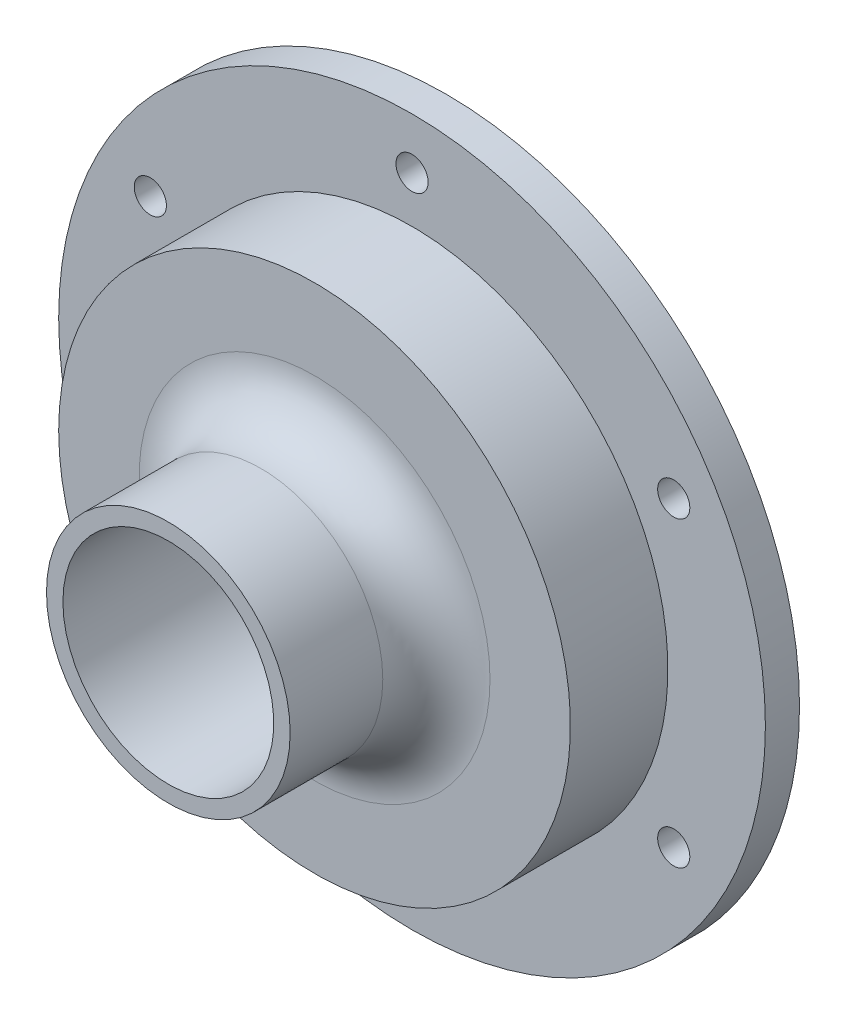
ISO-10303-21;
HEADER;
FILE_DESCRIPTION(('STEP AP214'),'2;1');
FILE_NAME('part.step','',(''),(''),'','','');
FILE_SCHEMA(('AUTOMOTIVE_DESIGN { 1 0 10303 214 1 1 1 1 }'));
ENDSEC;
DATA;
#1=APPLICATION_CONTEXT('core data for automotive mechanical design processes');
#2=APPLICATION_PROTOCOL_DEFINITION('international standard','automotive_design',2000,#1);
#3=PRODUCT_CONTEXT('',#1,'mechanical');
#4=PRODUCT('Part','Part','',(#3));
#5=PRODUCT_RELATED_PRODUCT_CATEGORY('part','',(#4));
#6=PRODUCT_DEFINITION_FORMATION('','',#4);
#7=PRODUCT_DEFINITION_CONTEXT('part definition',#1,'design');
#8=PRODUCT_DEFINITION('design','',#6,#7);
#9=PRODUCT_DEFINITION_SHAPE('','',#8);
#10=(LENGTH_UNIT() NAMED_UNIT(*) SI_UNIT(.MILLI.,.METRE.));
#11=(NAMED_UNIT(*) PLANE_ANGLE_UNIT() SI_UNIT($,.RADIAN.));
#12=(NAMED_UNIT(*) SI_UNIT($,.STERADIAN.) SOLID_ANGLE_UNIT());
#13=UNCERTAINTY_MEASURE_WITH_UNIT(LENGTH_MEASURE(1.E-05),#10,'distance_accuracy_value','');
#14=(GEOMETRIC_REPRESENTATION_CONTEXT(3) GLOBAL_UNCERTAINTY_ASSIGNED_CONTEXT((#13)) GLOBAL_UNIT_ASSIGNED_CONTEXT((#10,
#11,#12)) REPRESENTATION_CONTEXT('',''));
#15=CARTESIAN_POINT('',(0.,0.,0.));
#16=DIRECTION('',(0.,0.,1.));
#17=DIRECTION('',(1.,0.,0.));
#18=AXIS2_PLACEMENT_3D('',#15,#16,#17);
#19=CARTESIAN_POINT('',(0.,0.,0.));
#20=DIRECTION('',(0.,0.,-1.));
#21=DIRECTION('',(-1.,0.,0.));
#22=AXIS2_PLACEMENT_3D('',#19,#20,#21);
#23=CYLINDRICAL_SURFACE('',#22,72.5);
#24=CARTESIAN_POINT('',(0.,0.,7.));
#25=DIRECTION('',(0.,0.,-1.));
#26=DIRECTION('',(-1.,0.,0.));
#27=AXIS2_PLACEMENT_3D('',#24,#25,#26);
#28=CIRCLE('',#27,72.5);
#29=CARTESIAN_POINT('',(-72.5,0.,7.));
#30=VERTEX_POINT('',#29);
#31=EDGE_CURVE('E43',#30,#30,#28,.T.);
#32=ORIENTED_EDGE('',*,*,#31,.T.);
#33=EDGE_LOOP('',(#32));
#34=FACE_BOUND('',#33,.T.);
#35=CARTESIAN_POINT('',(0.,0.,0.));
#36=DIRECTION('',(0.,0.,-1.));
#37=DIRECTION('',(-1.,0.,0.));
#38=AXIS2_PLACEMENT_3D('',#35,#36,#37);
#39=CIRCLE('',#38,72.5);
#40=CARTESIAN_POINT('',(-72.5,0.,0.));
#41=VERTEX_POINT('',#40);
#42=EDGE_CURVE('E50',#41,#41,#39,.T.);
#43=ORIENTED_EDGE('',*,*,#42,.F.);
#44=EDGE_LOOP('',(#43));
#45=FACE_BOUND('',#44,.T.);
#46=ADVANCED_FACE('F30',(#34,#45),#23,.T.);
#47=CARTESIAN_POINT('',(-72.5,0.,7.));
#48=DIRECTION('',(0.,0.,1.));
#49=DIRECTION('',(1.,0.,0.));
#50=AXIS2_PLACEMENT_3D('',#47,#48,#49);
#51=PLANE('',#50);
#52=CARTESIAN_POINT('',(-53.6935750346348,31.0000000000006,7.));
#53=DIRECTION('',(0.,0.,1.));
#54=DIRECTION('',(1.,0.,0.));
#55=AXIS2_PLACEMENT_3D('',#52,#53,#54);
#56=CIRCLE('',#55,3.29999999999999);
#57=CARTESIAN_POINT('',(-50.3935750346348,31.0000000000006,7.));
#58=VERTEX_POINT('',#57);
#59=EDGE_CURVE('E34',#58,#58,#56,.T.);
#60=ORIENTED_EDGE('',*,*,#59,.F.);
#61=EDGE_LOOP('',(#60));
#62=FACE_BOUND('',#61,.T.);
#63=CARTESIAN_POINT('',(-53.6935750346355,-30.9999999999995,7.));
#64=DIRECTION('',(0.,0.,1.));
#65=DIRECTION('',(1.,0.,0.));
#66=AXIS2_PLACEMENT_3D('',#63,#64,#65);
#67=CIRCLE('',#66,3.29999999999999);
#68=CARTESIAN_POINT('',(-50.3935750346355,-30.9999999999995,7.));
#69=VERTEX_POINT('',#68);
#70=EDGE_CURVE('E66',#69,#69,#67,.T.);
#71=ORIENTED_EDGE('',*,*,#70,.F.);
#72=EDGE_LOOP('',(#71));
#73=FACE_BOUND('',#72,.T.);
#74=CARTESIAN_POINT('',(0.,-62.,7.));
#75=DIRECTION('',(0.,0.,1.));
#76=DIRECTION('',(1.,0.,0.));
#77=AXIS2_PLACEMENT_3D('',#74,#75,#76);
#78=CIRCLE('',#77,3.29999999999999);
#79=CARTESIAN_POINT('',(3.29999999999999,-62.,7.));
#80=VERTEX_POINT('',#79);
#81=EDGE_CURVE('E62',#80,#80,#78,.T.);
#82=ORIENTED_EDGE('',*,*,#81,.F.);
#83=EDGE_LOOP('',(#82));
#84=FACE_BOUND('',#83,.T.);
#85=CARTESIAN_POINT('',(53.6935750346351,-31.0000000000003,7.));
#86=DIRECTION('',(0.,0.,1.));
#87=DIRECTION('',(1.,0.,0.));
#88=AXIS2_PLACEMENT_3D('',#85,#86,#87);
#89=CIRCLE('',#88,3.29999999999999);
#90=CARTESIAN_POINT('',(56.9935750346351,-31.0000000000003,7.));
#91=VERTEX_POINT('',#90);
#92=EDGE_CURVE('E57',#91,#91,#89,.T.);
#93=ORIENTED_EDGE('',*,*,#92,.F.);
#94=EDGE_LOOP('',(#93));
#95=FACE_BOUND('',#94,.T.);
#96=CARTESIAN_POINT('',(53.6935750346353,30.9999999999999,7.));
#97=DIRECTION('',(0.,0.,1.));
#98=DIRECTION('',(1.,0.,0.));
#99=AXIS2_PLACEMENT_3D('',#96,#97,#98);
#100=CIRCLE('',#99,3.29999999999999);
#101=CARTESIAN_POINT('',(56.9935750346353,30.9999999999999,7.));
#102=VERTEX_POINT('',#101);
#103=EDGE_CURVE('E52',#102,#102,#100,.T.);
#104=ORIENTED_EDGE('',*,*,#103,.F.);
#105=EDGE_LOOP('',(#104));
#106=FACE_BOUND('',#105,.T.);
#107=CARTESIAN_POINT('',(0.,62.,7.));
#108=DIRECTION('',(0.,0.,1.));
#109=DIRECTION('',(1.,0.,0.));
#110=AXIS2_PLACEMENT_3D('',#107,#108,#109);
#111=CIRCLE('',#110,3.29999999999999);
#112=CARTESIAN_POINT('',(3.29999999999999,62.,7.));
#113=VERTEX_POINT('',#112);
#114=EDGE_CURVE('E47',#113,#113,#111,.T.);
#115=ORIENTED_EDGE('',*,*,#114,.F.);
#116=EDGE_LOOP('',(#115));
#117=FACE_BOUND('',#116,.T.);
#118=CARTESIAN_POINT('',(0.,0.,7.));
#119=DIRECTION('',(0.,0.,-1.));
#120=DIRECTION('',(-1.,0.,0.));
#121=AXIS2_PLACEMENT_3D('',#118,#119,#120);
#122=CIRCLE('',#121,52.5);
#123=CARTESIAN_POINT('',(-52.5,0.,7.));
#124=VERTEX_POINT('',#123);
#125=EDGE_CURVE('E124',#124,#124,#122,.T.);
#126=ORIENTED_EDGE('',*,*,#125,.T.);
#127=EDGE_LOOP('',(#126));
#128=FACE_BOUND('',#127,.T.);
#129=ORIENTED_EDGE('',*,*,#31,.F.);
#130=EDGE_LOOP('',(#129));
#131=FACE_BOUND('',#130,.T.);
#132=ADVANCED_FACE('F131',(#62,#73,#84,#95,#106,#117,#128,#131),#51,.T.);
#133=CARTESIAN_POINT('',(0.,0.,0.));
#134=DIRECTION('',(0.,0.,-1.));
#135=DIRECTION('',(-1.,0.,0.));
#136=AXIS2_PLACEMENT_3D('',#133,#134,#135);
#137=CYLINDRICAL_SURFACE('',#136,52.5);
#138=CARTESIAN_POINT('',(0.,0.,27.));
#139=DIRECTION('',(0.,0.,-1.));
#140=DIRECTION('',(-1.,0.,0.));
#141=AXIS2_PLACEMENT_3D('',#138,#139,#140);
#142=CIRCLE('',#141,52.5);
#143=CARTESIAN_POINT('',(-52.5,0.,27.));
#144=VERTEX_POINT('',#143);
#145=EDGE_CURVE('E121',#144,#144,#142,.T.);
#146=ORIENTED_EDGE('',*,*,#145,.T.);
#147=EDGE_LOOP('',(#146));
#148=FACE_BOUND('',#147,.T.);
#149=ORIENTED_EDGE('',*,*,#125,.F.);
#150=EDGE_LOOP('',(#149));
#151=FACE_BOUND('',#150,.T.);
#152=ADVANCED_FACE('F133',(#148,#151),#137,.T.);
#153=CARTESIAN_POINT('',(-52.5,0.,27.));
#154=DIRECTION('',(0.,0.,1.));
#155=DIRECTION('',(1.,0.,0.));
#156=AXIS2_PLACEMENT_3D('',#153,#154,#155);
#157=PLANE('',#156);
#158=CARTESIAN_POINT('',(0.,0.,27.));
#159=DIRECTION('',(0.,0.,1.));
#160=DIRECTION('',(1.,0.,0.));
#161=AXIS2_PLACEMENT_3D('',#158,#159,#160);
#162=CIRCLE('',#161,36.);
#163=CARTESIAN_POINT('',(36.,0.,27.));
#164=VERTEX_POINT('',#163);
#165=EDGE_CURVE('E38',#164,#164,#162,.F.);
#166=ORIENTED_EDGE('',*,*,#165,.T.);
#167=EDGE_LOOP('',(#166));
#168=FACE_BOUND('',#167,.T.);
#169=ORIENTED_EDGE('',*,*,#145,.F.);
#170=EDGE_LOOP('',(#169));
#171=FACE_BOUND('',#170,.T.);
#172=ADVANCED_FACE('F140',(#168,#171),#157,.T.);
#173=CARTESIAN_POINT('',(0.,0.,0.));
#174=DIRECTION('',(0.,0.,-1.));
#175=DIRECTION('',(-1.,0.,0.));
#176=AXIS2_PLACEMENT_3D('',#173,#174,#175);
#177=CYLINDRICAL_SURFACE('',#176,25.);
#178=CARTESIAN_POINT('',(0.,0.,38.));
#179=DIRECTION('',(0.,0.,1.));
#180=DIRECTION('',(1.,0.,0.));
#181=AXIS2_PLACEMENT_3D('',#178,#179,#180);
#182=CIRCLE('',#181,25.);
#183=CARTESIAN_POINT('',(25.,0.,38.));
#184=VERTEX_POINT('',#183);
#185=EDGE_CURVE('E10',#184,#184,#182,.T.);
#186=ORIENTED_EDGE('',*,*,#185,.T.);
#187=EDGE_LOOP('',(#186));
#188=FACE_BOUND('',#187,.T.);
#189=CARTESIAN_POINT('',(0.,0.,57.));
#190=DIRECTION('',(0.,0.,-1.));
#191=DIRECTION('',(-1.,0.,0.));
#192=AXIS2_PLACEMENT_3D('',#189,#190,#191);
#193=CIRCLE('',#192,25.);
#194=CARTESIAN_POINT('',(-25.,0.,57.));
#195=VERTEX_POINT('',#194);
#196=EDGE_CURVE('E118',#195,#195,#193,.T.);
#197=ORIENTED_EDGE('',*,*,#196,.T.);
#198=EDGE_LOOP('',(#197));
#199=FACE_BOUND('',#198,.T.);
#200=ADVANCED_FACE('F148',(#188,#199),#177,.T.);
#201=CARTESIAN_POINT('',(-25.,0.,57.));
#202=DIRECTION('',(0.,0.,1.));
#203=DIRECTION('',(1.,0.,0.));
#204=AXIS2_PLACEMENT_3D('',#201,#202,#203);
#205=PLANE('',#204);
#206=CARTESIAN_POINT('',(0.,0.,57.));
#207=DIRECTION('',(0.,0.,-1.));
#208=DIRECTION('',(-1.,0.,0.));
#209=AXIS2_PLACEMENT_3D('',#206,#207,#208);
#210=CIRCLE('',#209,21.63);
#211=CARTESIAN_POINT('',(-21.63,0.,57.));
#212=VERTEX_POINT('',#211);
#213=EDGE_CURVE('E115',#212,#212,#210,.T.);
#214=ORIENTED_EDGE('',*,*,#213,.T.);
#215=EDGE_LOOP('',(#214));
#216=FACE_BOUND('',#215,.T.);
#217=ORIENTED_EDGE('',*,*,#196,.F.);
#218=EDGE_LOOP('',(#217));
#219=FACE_BOUND('',#218,.T.);
#220=ADVANCED_FACE('F152',(#216,#219),#205,.T.);
#221=CARTESIAN_POINT('',(0.,0.,0.));
#222=DIRECTION('',(0.,0.,-1.));
#223=DIRECTION('',(-1.,0.,0.));
#224=AXIS2_PLACEMENT_3D('',#221,#222,#223);
#225=CYLINDRICAL_SURFACE('',#224,21.63);
#226=CARTESIAN_POINT('',(0.,0.,0.));
#227=DIRECTION('',(0.,0.,-1.));
#228=DIRECTION('',(-1.,0.,0.));
#229=AXIS2_PLACEMENT_3D('',#226,#227,#228);
#230=CIRCLE('',#229,21.63);
#231=CARTESIAN_POINT('',(-21.63,0.,0.));
#232=VERTEX_POINT('',#231);
#233=EDGE_CURVE('E112',#232,#232,#230,.T.);
#234=ORIENTED_EDGE('',*,*,#233,.T.);
#235=EDGE_LOOP('',(#234));
#236=FACE_BOUND('',#235,.T.);
#237=ORIENTED_EDGE('',*,*,#213,.F.);
#238=EDGE_LOOP('',(#237));
#239=FACE_BOUND('',#238,.T.);
#240=ADVANCED_FACE('F155',(#236,#239),#225,.F.);
#241=CARTESIAN_POINT('',(-21.63,0.,0.));
#242=DIRECTION('',(0.,0.,-1.));
#243=DIRECTION('',(-1.,0.,0.));
#244=AXIS2_PLACEMENT_3D('',#241,#242,#243);
#245=PLANE('',#244);
#246=CARTESIAN_POINT('',(-53.6935750346348,31.0000000000006,0.));
#247=DIRECTION('',(0.,0.,-1.));
#248=DIRECTION('',(-1.,0.,0.));
#249=AXIS2_PLACEMENT_3D('',#246,#247,#248);
#250=CIRCLE('',#249,7.27349999999999);
#251=CARTESIAN_POINT('',(-60.9670750346348,31.0000000000006,0.));
#252=VERTEX_POINT('',#251);
#253=EDGE_CURVE('E242',#252,#252,#250,.T.);
#254=ORIENTED_EDGE('',*,*,#253,.F.);
#255=EDGE_LOOP('',(#254));
#256=FACE_BOUND('',#255,.T.);
#257=CARTESIAN_POINT('',(-53.6935750346355,-30.9999999999995,0.));
#258=DIRECTION('',(0.,0.,-1.));
#259=DIRECTION('',(-1.,0.,0.));
#260=AXIS2_PLACEMENT_3D('',#257,#258,#259);
#261=CIRCLE('',#260,7.27349999999999);
#262=CARTESIAN_POINT('',(-60.9670750346355,-30.9999999999995,0.));
#263=VERTEX_POINT('',#262);
#264=EDGE_CURVE('E81',#263,#263,#261,.T.);
#265=ORIENTED_EDGE('',*,*,#264,.F.);
#266=EDGE_LOOP('',(#265));
#267=FACE_BOUND('',#266,.T.);
#268=CARTESIAN_POINT('',(0.,-62.,0.));
#269=DIRECTION('',(0.,0.,-1.));
#270=DIRECTION('',(-1.,0.,0.));
#271=AXIS2_PLACEMENT_3D('',#268,#269,#270);
#272=CIRCLE('',#271,7.27349999999999);
#273=CARTESIAN_POINT('',(-7.27349999999999,-62.,0.));
#274=VERTEX_POINT('',#273);
#275=EDGE_CURVE('E68',#274,#274,#272,.T.);
#276=ORIENTED_EDGE('',*,*,#275,.F.);
#277=EDGE_LOOP('',(#276));
#278=FACE_BOUND('',#277,.T.);
#279=CARTESIAN_POINT('',(53.6935750346351,-31.0000000000003,0.));
#280=DIRECTION('',(0.,0.,-1.));
#281=DIRECTION('',(-1.,0.,0.));
#282=AXIS2_PLACEMENT_3D('',#279,#280,#281);
#283=CIRCLE('',#282,7.27349999999999);
#284=CARTESIAN_POINT('',(46.4200750346351,-31.0000000000003,0.));
#285=VERTEX_POINT('',#284);
#286=EDGE_CURVE('E64',#285,#285,#283,.T.);
#287=ORIENTED_EDGE('',*,*,#286,.F.);
#288=EDGE_LOOP('',(#287));
#289=FACE_BOUND('',#288,.T.);
#290=CARTESIAN_POINT('',(53.6935750346353,30.9999999999999,0.));
#291=DIRECTION('',(0.,0.,-1.));
#292=DIRECTION('',(-1.,0.,0.));
#293=AXIS2_PLACEMENT_3D('',#290,#291,#292);
#294=CIRCLE('',#293,7.27349999999999);
#295=CARTESIAN_POINT('',(46.4200750346353,30.9999999999999,0.));
#296=VERTEX_POINT('',#295);
#297=EDGE_CURVE('E60',#296,#296,#294,.T.);
#298=ORIENTED_EDGE('',*,*,#297,.F.);
#299=EDGE_LOOP('',(#298));
#300=FACE_BOUND('',#299,.T.);
#301=CARTESIAN_POINT('',(0.,62.,0.));
#302=DIRECTION('',(0.,0.,-1.));
#303=DIRECTION('',(-1.,0.,0.));
#304=AXIS2_PLACEMENT_3D('',#301,#302,#303);
#305=CIRCLE('',#304,7.27349999999999);
#306=CARTESIAN_POINT('',(-7.27349999999999,62.,0.));
#307=VERTEX_POINT('',#306);
#308=EDGE_CURVE('E55',#307,#307,#305,.T.);
#309=ORIENTED_EDGE('',*,*,#308,.F.);
#310=EDGE_LOOP('',(#309));
#311=FACE_BOUND('',#310,.T.);
#312=ORIENTED_EDGE('',*,*,#42,.T.);
#313=EDGE_LOOP('',(#312));
#314=FACE_BOUND('',#313,.T.);
#315=ORIENTED_EDGE('',*,*,#233,.F.);
#316=EDGE_LOOP('',(#315));
#317=FACE_BOUND('',#316,.T.);
#318=ADVANCED_FACE('F159',(#256,#267,#278,#289,#300,#311,#314,#317),#245,.T.);
#319=CARTESIAN_POINT('',(0.,0.,38.));
#320=DIRECTION('',(0.,0.,1.));
#321=DIRECTION('',(1.,0.,0.));
#322=AXIS2_PLACEMENT_3D('',#319,#320,#321);
#323=TOROIDAL_SURFACE('',#322,36.,11.);
#324=ORIENTED_EDGE('',*,*,#185,.F.);
#325=EDGE_LOOP('',(#324));
#326=FACE_BOUND('',#325,.T.);
#327=ORIENTED_EDGE('',*,*,#165,.F.);
#328=EDGE_LOOP('',(#327));
#329=FACE_BOUND('',#328,.T.);
#330=ADVANCED_FACE('F32',(#326,#329),#323,.F.);
#331=CARTESIAN_POINT('',(0.,62.,0.));
#332=DIRECTION('',(0.,0.,-1.));
#333=DIRECTION('',(-1.,0.,0.));
#334=AXIS2_PLACEMENT_3D('',#331,#332,#333);
#335=CYLINDRICAL_SURFACE('',#334,3.29999999999999);
#336=ORIENTED_EDGE('',*,*,#114,.T.);
#337=EDGE_LOOP('',(#336));
#338=FACE_BOUND('',#337,.T.);
#339=CARTESIAN_POINT('',(0.,62.,1.));
#340=DIRECTION('',(0.,0.,-1.));
#341=DIRECTION('',(-1.,0.,0.));
#342=AXIS2_PLACEMENT_3D('',#339,#340,#341);
#343=CIRCLE('',#342,3.3);
#344=CARTESIAN_POINT('',(-3.3,62.,1.));
#345=VERTEX_POINT('',#344);
#346=EDGE_CURVE('E51',#345,#345,#343,.T.);
#347=ORIENTED_EDGE('',*,*,#346,.T.);
#348=EDGE_LOOP('',(#347));
#349=FACE_BOUND('',#348,.T.);
#350=ADVANCED_FACE('F164',(#338,#349),#335,.F.);
#351=CARTESIAN_POINT('',(3.3,62.,1.));
#352=DIRECTION('',(0.,0.,1.));
#353=DIRECTION('',(1.,0.,0.));
#354=AXIS2_PLACEMENT_3D('',#351,#352,#353);
#355=PLANE('',#354);
#356=ORIENTED_EDGE('',*,*,#346,.F.);
#357=EDGE_LOOP('',(#356));
#358=FACE_BOUND('',#357,.T.);
#359=CARTESIAN_POINT('',(0.,62.,1.));
#360=DIRECTION('',(0.,0.,-1.));
#361=DIRECTION('',(-1.,0.,0.));
#362=AXIS2_PLACEMENT_3D('',#359,#360,#361);
#363=CIRCLE('',#362,7.2735);
#364=CARTESIAN_POINT('',(-7.2735,62.,1.));
#365=VERTEX_POINT('',#364);
#366=EDGE_CURVE('E105',#365,#365,#363,.T.);
#367=ORIENTED_EDGE('',*,*,#366,.T.);
#368=EDGE_LOOP('',(#367));
#369=FACE_BOUND('',#368,.T.);
#370=ADVANCED_FACE('F167',(#358,#369),#355,.F.);
#371=CARTESIAN_POINT('',(0.,62.,0.));
#372=DIRECTION('',(0.,0.,-1.));
#373=DIRECTION('',(-1.,0.,0.));
#374=AXIS2_PLACEMENT_3D('',#371,#372,#373);
#375=CYLINDRICAL_SURFACE('',#374,7.2735);
#376=ORIENTED_EDGE('',*,*,#366,.F.);
#377=EDGE_LOOP('',(#376));
#378=FACE_BOUND('',#377,.T.);
#379=ORIENTED_EDGE('',*,*,#308,.T.);
#380=EDGE_LOOP('',(#379));
#381=FACE_BOUND('',#380,.T.);
#382=ADVANCED_FACE('F171',(#378,#381),#375,.F.);
#383=CARTESIAN_POINT('',(53.6935750346353,30.9999999999999,0.));
#384=DIRECTION('',(0.,0.,-1.));
#385=DIRECTION('',(-1.,0.,0.));
#386=AXIS2_PLACEMENT_3D('',#383,#384,#385);
#387=CYLINDRICAL_SURFACE('',#386,3.29999999999999);
#388=ORIENTED_EDGE('',*,*,#103,.T.);
#389=EDGE_LOOP('',(#388));
#390=FACE_BOUND('',#389,.T.);
#391=CARTESIAN_POINT('',(53.6935750346353,30.9999999999999,1.));
#392=DIRECTION('',(0.,0.,-1.));
#393=DIRECTION('',(-1.,0.,0.));
#394=AXIS2_PLACEMENT_3D('',#391,#392,#393);
#395=CIRCLE('',#394,3.3);
#396=CARTESIAN_POINT('',(50.3935750346353,30.9999999999999,1.));
#397=VERTEX_POINT('',#396);
#398=EDGE_CURVE('E56',#397,#397,#395,.T.);
#399=ORIENTED_EDGE('',*,*,#398,.T.);
#400=EDGE_LOOP('',(#399));
#401=FACE_BOUND('',#400,.T.);
#402=ADVANCED_FACE('F175',(#390,#401),#387,.F.);
#403=CARTESIAN_POINT('',(56.9935750346353,30.9999999999999,1.));
#404=DIRECTION('',(0.,0.,1.));
#405=DIRECTION('',(1.,0.,0.));
#406=AXIS2_PLACEMENT_3D('',#403,#404,#405);
#407=PLANE('',#406);
#408=ORIENTED_EDGE('',*,*,#398,.F.);
#409=EDGE_LOOP('',(#408));
#410=FACE_BOUND('',#409,.T.);
#411=CARTESIAN_POINT('',(53.6935750346353,30.9999999999999,1.));
#412=DIRECTION('',(0.,0.,-1.));
#413=DIRECTION('',(-1.,0.,0.));
#414=AXIS2_PLACEMENT_3D('',#411,#412,#413);
#415=CIRCLE('',#414,7.27349999999999);
#416=CARTESIAN_POINT('',(46.4200750346353,30.9999999999999,1.));
#417=VERTEX_POINT('',#416);
#418=EDGE_CURVE('E98',#417,#417,#415,.T.);
#419=ORIENTED_EDGE('',*,*,#418,.T.);
#420=EDGE_LOOP('',(#419));
#421=FACE_BOUND('',#420,.T.);
#422=ADVANCED_FACE('F179',(#410,#421),#407,.F.);
#423=CARTESIAN_POINT('',(53.6935750346353,30.9999999999999,0.));
#424=DIRECTION('',(0.,0.,-1.));
#425=DIRECTION('',(-1.,0.,0.));
#426=AXIS2_PLACEMENT_3D('',#423,#424,#425);
#427=CYLINDRICAL_SURFACE('',#426,7.27349999999999);
#428=ORIENTED_EDGE('',*,*,#418,.F.);
#429=EDGE_LOOP('',(#428));
#430=FACE_BOUND('',#429,.T.);
#431=ORIENTED_EDGE('',*,*,#297,.T.);
#432=EDGE_LOOP('',(#431));
#433=FACE_BOUND('',#432,.T.);
#434=ADVANCED_FACE('F183',(#430,#433),#427,.F.);
#435=CARTESIAN_POINT('',(53.6935750346351,-31.0000000000003,0.));
#436=DIRECTION('',(0.,0.,-1.));
#437=DIRECTION('',(-1.,0.,0.));
#438=AXIS2_PLACEMENT_3D('',#435,#436,#437);
#439=CYLINDRICAL_SURFACE('',#438,3.29999999999999);
#440=ORIENTED_EDGE('',*,*,#92,.T.);
#441=EDGE_LOOP('',(#440));
#442=FACE_BOUND('',#441,.T.);
#443=CARTESIAN_POINT('',(53.6935750346351,-31.0000000000003,1.));
#444=DIRECTION('',(0.,0.,-1.));
#445=DIRECTION('',(-1.,0.,0.));
#446=AXIS2_PLACEMENT_3D('',#443,#444,#445);
#447=CIRCLE('',#446,3.3);
#448=CARTESIAN_POINT('',(50.3935750346351,-31.0000000000003,1.));
#449=VERTEX_POINT('',#448);
#450=EDGE_CURVE('E61',#449,#449,#447,.T.);
#451=ORIENTED_EDGE('',*,*,#450,.T.);
#452=EDGE_LOOP('',(#451));
#453=FACE_BOUND('',#452,.T.);
#454=ADVANCED_FACE('F187',(#442,#453),#439,.F.);
#455=CARTESIAN_POINT('',(56.9935750346351,-31.0000000000003,1.));
#456=DIRECTION('',(0.,0.,1.));
#457=DIRECTION('',(1.,0.,0.));
#458=AXIS2_PLACEMENT_3D('',#455,#456,#457);
#459=PLANE('',#458);
#460=ORIENTED_EDGE('',*,*,#450,.F.);
#461=EDGE_LOOP('',(#460));
#462=FACE_BOUND('',#461,.T.);
#463=CARTESIAN_POINT('',(53.6935750346351,-31.0000000000003,1.));
#464=DIRECTION('',(0.,0.,-1.));
#465=DIRECTION('',(-1.,0.,0.));
#466=AXIS2_PLACEMENT_3D('',#463,#464,#465);
#467=CIRCLE('',#466,7.27349999999999);
#468=CARTESIAN_POINT('',(46.4200750346351,-31.0000000000003,1.));
#469=VERTEX_POINT('',#468);
#470=EDGE_CURVE('E91',#469,#469,#467,.T.);
#471=ORIENTED_EDGE('',*,*,#470,.T.);
#472=EDGE_LOOP('',(#471));
#473=FACE_BOUND('',#472,.T.);
#474=ADVANCED_FACE('F191',(#462,#473),#459,.F.);
#475=CARTESIAN_POINT('',(53.6935750346351,-31.0000000000003,0.));
#476=DIRECTION('',(0.,0.,-1.));
#477=DIRECTION('',(-1.,0.,0.));
#478=AXIS2_PLACEMENT_3D('',#475,#476,#477);
#479=CYLINDRICAL_SURFACE('',#478,7.27349999999999);
#480=ORIENTED_EDGE('',*,*,#470,.F.);
#481=EDGE_LOOP('',(#480));
#482=FACE_BOUND('',#481,.T.);
#483=ORIENTED_EDGE('',*,*,#286,.T.);
#484=EDGE_LOOP('',(#483));
#485=FACE_BOUND('',#484,.T.);
#486=ADVANCED_FACE('F195',(#482,#485),#479,.F.);
#487=CARTESIAN_POINT('',(0.,-62.,0.));
#488=DIRECTION('',(0.,0.,-1.));
#489=DIRECTION('',(-1.,0.,0.));
#490=AXIS2_PLACEMENT_3D('',#487,#488,#489);
#491=CYLINDRICAL_SURFACE('',#490,3.29999999999999);
#492=ORIENTED_EDGE('',*,*,#81,.T.);
#493=EDGE_LOOP('',(#492));
#494=FACE_BOUND('',#493,.T.);
#495=CARTESIAN_POINT('',(0.,-62.,1.));
#496=DIRECTION('',(0.,0.,-1.));
#497=DIRECTION('',(-1.,0.,0.));
#498=AXIS2_PLACEMENT_3D('',#495,#496,#497);
#499=CIRCLE('',#498,3.3);
#500=CARTESIAN_POINT('',(-3.3,-62.,1.));
#501=VERTEX_POINT('',#500);
#502=EDGE_CURVE('E65',#501,#501,#499,.T.);
#503=ORIENTED_EDGE('',*,*,#502,.T.);
#504=EDGE_LOOP('',(#503));
#505=FACE_BOUND('',#504,.T.);
#506=ADVANCED_FACE('F199',(#494,#505),#491,.F.);
#507=CARTESIAN_POINT('',(3.3,-62.,1.));
#508=DIRECTION('',(0.,0.,1.));
#509=DIRECTION('',(1.,0.,0.));
#510=AXIS2_PLACEMENT_3D('',#507,#508,#509);
#511=PLANE('',#510);
#512=ORIENTED_EDGE('',*,*,#502,.F.);
#513=EDGE_LOOP('',(#512));
#514=FACE_BOUND('',#513,.T.);
#515=CARTESIAN_POINT('',(0.,-62.,1.));
#516=DIRECTION('',(0.,0.,-1.));
#517=DIRECTION('',(-1.,0.,0.));
#518=AXIS2_PLACEMENT_3D('',#515,#516,#517);
#519=CIRCLE('',#518,7.2735);
#520=CARTESIAN_POINT('',(-7.2735,-62.,1.));
#521=VERTEX_POINT('',#520);
#522=EDGE_CURVE('E73',#521,#521,#519,.T.);
#523=ORIENTED_EDGE('',*,*,#522,.T.);
#524=EDGE_LOOP('',(#523));
#525=FACE_BOUND('',#524,.T.);
#526=ADVANCED_FACE('F203',(#514,#525),#511,.F.);
#527=CARTESIAN_POINT('',(0.,-62.,0.));
#528=DIRECTION('',(0.,0.,-1.));
#529=DIRECTION('',(-1.,0.,0.));
#530=AXIS2_PLACEMENT_3D('',#527,#528,#529);
#531=CYLINDRICAL_SURFACE('',#530,7.2735);
#532=ORIENTED_EDGE('',*,*,#522,.F.);
#533=EDGE_LOOP('',(#532));
#534=FACE_BOUND('',#533,.T.);
#535=ORIENTED_EDGE('',*,*,#275,.T.);
#536=EDGE_LOOP('',(#535));
#537=FACE_BOUND('',#536,.T.);
#538=ADVANCED_FACE('F207',(#534,#537),#531,.F.);
#539=CARTESIAN_POINT('',(-53.6935750346355,-30.9999999999995,0.));
#540=DIRECTION('',(0.,0.,-1.));
#541=DIRECTION('',(-1.,0.,0.));
#542=AXIS2_PLACEMENT_3D('',#539,#540,#541);
#543=CYLINDRICAL_SURFACE('',#542,3.29999999999999);
#544=ORIENTED_EDGE('',*,*,#70,.T.);
#545=EDGE_LOOP('',(#544));
#546=FACE_BOUND('',#545,.T.);
#547=CARTESIAN_POINT('',(-53.6935750346355,-30.9999999999995,1.));
#548=DIRECTION('',(0.,0.,-1.));
#549=DIRECTION('',(-1.,0.,0.));
#550=AXIS2_PLACEMENT_3D('',#547,#548,#549);
#551=CIRCLE('',#550,3.3);
#552=CARTESIAN_POINT('',(-56.9935750346355,-30.9999999999995,1.));
#553=VERTEX_POINT('',#552);
#554=EDGE_CURVE('E69',#553,#553,#551,.T.);
#555=ORIENTED_EDGE('',*,*,#554,.T.);
#556=EDGE_LOOP('',(#555));
#557=FACE_BOUND('',#556,.T.);
#558=ADVANCED_FACE('F211',(#546,#557),#543,.F.);
#559=CARTESIAN_POINT('',(-50.3935750346355,-30.9999999999995,1.));
#560=DIRECTION('',(0.,0.,1.));
#561=DIRECTION('',(1.,0.,0.));
#562=AXIS2_PLACEMENT_3D('',#559,#560,#561);
#563=PLANE('',#562);
#564=ORIENTED_EDGE('',*,*,#554,.F.);
#565=EDGE_LOOP('',(#564));
#566=FACE_BOUND('',#565,.T.);
#567=CARTESIAN_POINT('',(-53.6935750346355,-30.9999999999995,1.));
#568=DIRECTION('',(0.,0.,-1.));
#569=DIRECTION('',(-1.,0.,0.));
#570=AXIS2_PLACEMENT_3D('',#567,#568,#569);
#571=CIRCLE('',#570,7.27349999999999);
#572=CARTESIAN_POINT('',(-60.9670750346355,-30.9999999999995,1.));
#573=VERTEX_POINT('',#572);
#574=EDGE_CURVE('E76',#573,#573,#571,.T.);
#575=ORIENTED_EDGE('',*,*,#574,.T.);
#576=EDGE_LOOP('',(#575));
#577=FACE_BOUND('',#576,.T.);
#578=ADVANCED_FACE('F215',(#566,#577),#563,.F.);
#579=CARTESIAN_POINT('',(-53.6935750346355,-30.9999999999995,0.));
#580=DIRECTION('',(0.,0.,-1.));
#581=DIRECTION('',(-1.,0.,0.));
#582=AXIS2_PLACEMENT_3D('',#579,#580,#581);
#583=CYLINDRICAL_SURFACE('',#582,7.27349999999999);
#584=ORIENTED_EDGE('',*,*,#574,.F.);
#585=EDGE_LOOP('',(#584));
#586=FACE_BOUND('',#585,.T.);
#587=ORIENTED_EDGE('',*,*,#264,.T.);
#588=EDGE_LOOP('',(#587));
#589=FACE_BOUND('',#588,.T.);
#590=ADVANCED_FACE('F218',(#586,#589),#583,.F.);
#591=CARTESIAN_POINT('',(-53.6935750346348,31.0000000000006,0.));
#592=DIRECTION('',(0.,0.,-1.));
#593=DIRECTION('',(-1.,0.,0.));
#594=AXIS2_PLACEMENT_3D('',#591,#592,#593);
#595=CYLINDRICAL_SURFACE('',#594,3.29999999999999);
#596=ORIENTED_EDGE('',*,*,#59,.T.);
#597=EDGE_LOOP('',(#596));
#598=FACE_BOUND('',#597,.T.);
#599=CARTESIAN_POINT('',(-53.6935750346348,31.0000000000006,1.));
#600=DIRECTION('',(0.,0.,-1.));
#601=DIRECTION('',(-1.,0.,0.));
#602=AXIS2_PLACEMENT_3D('',#599,#600,#601);
#603=CIRCLE('',#602,3.3);
#604=CARTESIAN_POINT('',(-56.9935750346348,31.0000000000006,1.));
#605=VERTEX_POINT('',#604);
#606=EDGE_CURVE('E244',#605,#605,#603,.T.);
#607=ORIENTED_EDGE('',*,*,#606,.T.);
#608=EDGE_LOOP('',(#607));
#609=FACE_BOUND('',#608,.T.);
#610=ADVANCED_FACE('F222',(#598,#609),#595,.F.);
#611=CARTESIAN_POINT('',(-50.3935750346348,31.0000000000006,1.));
#612=DIRECTION('',(0.,0.,1.));
#613=DIRECTION('',(1.,0.,0.));
#614=AXIS2_PLACEMENT_3D('',#611,#612,#613);
#615=PLANE('',#614);
#616=ORIENTED_EDGE('',*,*,#606,.F.);
#617=EDGE_LOOP('',(#616));
#618=FACE_BOUND('',#617,.T.);
#619=CARTESIAN_POINT('',(-53.6935750346348,31.0000000000006,1.));
#620=DIRECTION('',(0.,0.,-1.));
#621=DIRECTION('',(-1.,0.,0.));
#622=AXIS2_PLACEMENT_3D('',#619,#620,#621);
#623=CIRCLE('',#622,7.27349999999999);
#624=CARTESIAN_POINT('',(-60.9670750346348,31.0000000000006,1.));
#625=VERTEX_POINT('',#624);
#626=EDGE_CURVE('E239',#625,#625,#623,.T.);
#627=ORIENTED_EDGE('',*,*,#626,.T.);
#628=EDGE_LOOP('',(#627));
#629=FACE_BOUND('',#628,.T.);
#630=ADVANCED_FACE('F226',(#618,#629),#615,.F.);
#631=CARTESIAN_POINT('',(-53.6935750346348,31.0000000000006,0.));
#632=DIRECTION('',(0.,0.,-1.));
#633=DIRECTION('',(-1.,0.,0.));
#634=AXIS2_PLACEMENT_3D('',#631,#632,#633);
#635=CYLINDRICAL_SURFACE('',#634,7.27349999999999);
#636=ORIENTED_EDGE('',*,*,#626,.F.);
#637=EDGE_LOOP('',(#636));
#638=FACE_BOUND('',#637,.T.);
#639=ORIENTED_EDGE('',*,*,#253,.T.);
#640=EDGE_LOOP('',(#639));
#641=FACE_BOUND('',#640,.T.);
#642=ADVANCED_FACE('F230',(#638,#641),#635,.F.);
#643=CLOSED_SHELL('',(#46,#132,#152,#172,#200,#220,#240,#318,#330,#350,#370,#382,#402,#422,#434,
#454,#474,#486,#506,#526,#538,#558,#578,#590,#610,#630,#642));
#644=MANIFOLD_SOLID_BREP('B2',#643);
#645=ADVANCED_BREP_SHAPE_REPRESENTATION('',(#18,#644),#14);
#646=SHAPE_DEFINITION_REPRESENTATION(#9,#645);
ENDSEC;
END-ISO-10303-21;
